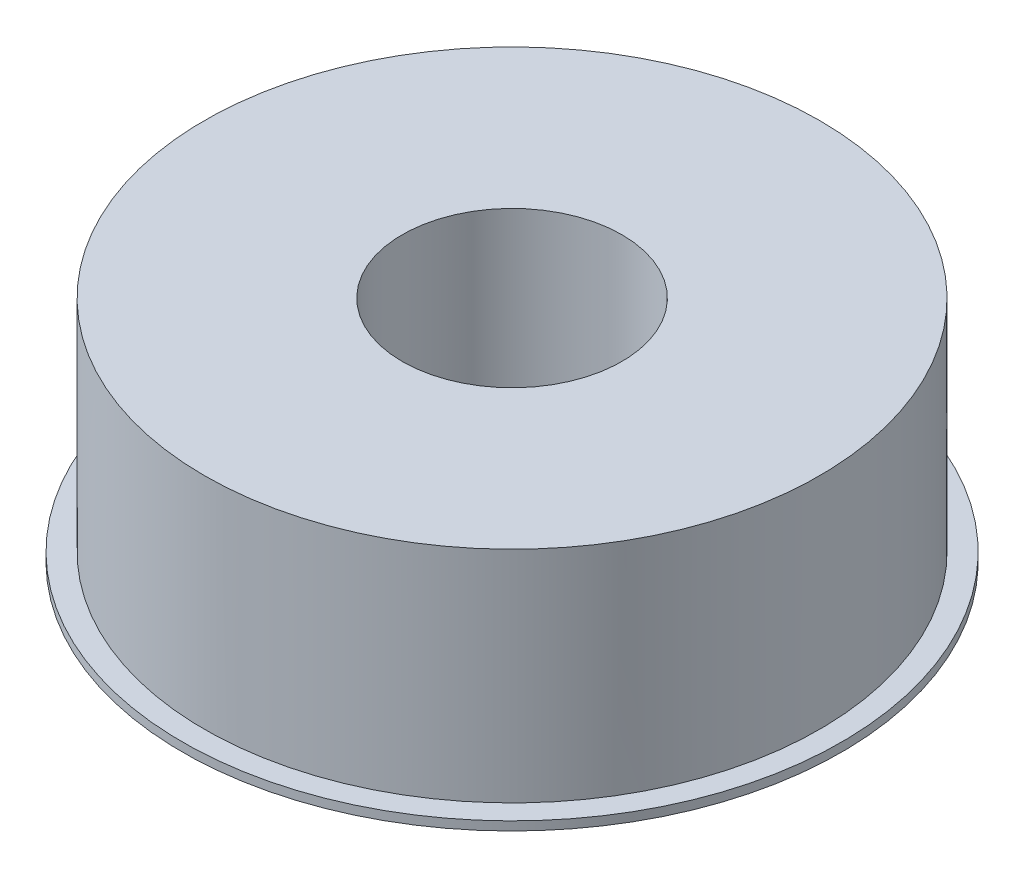
ISO-10303-21;
HEADER;
FILE_DESCRIPTION(('STEP AP214'),'2;1');
FILE_NAME('part.step','',(''),(''),'','','');
FILE_SCHEMA(('AUTOMOTIVE_DESIGN { 1 0 10303 214 1 1 1 1 }'));
ENDSEC;
DATA;
#1=APPLICATION_CONTEXT('core data for automotive mechanical design processes');
#2=APPLICATION_PROTOCOL_DEFINITION('international standard','automotive_design',2000,#1);
#3=PRODUCT_CONTEXT('',#1,'mechanical');
#4=PRODUCT('Part','Part','',(#3));
#5=PRODUCT_RELATED_PRODUCT_CATEGORY('part','',(#4));
#6=PRODUCT_DEFINITION_FORMATION('','',#4);
#7=PRODUCT_DEFINITION_CONTEXT('part definition',#1,'design');
#8=PRODUCT_DEFINITION('design','',#6,#7);
#9=PRODUCT_DEFINITION_SHAPE('','',#8);
#10=(LENGTH_UNIT() NAMED_UNIT(*) SI_UNIT(.MILLI.,.METRE.));
#11=(NAMED_UNIT(*) PLANE_ANGLE_UNIT() SI_UNIT($,.RADIAN.));
#12=(NAMED_UNIT(*) SI_UNIT($,.STERADIAN.) SOLID_ANGLE_UNIT());
#13=UNCERTAINTY_MEASURE_WITH_UNIT(LENGTH_MEASURE(1.E-05),#10,'distance_accuracy_value','');
#14=(GEOMETRIC_REPRESENTATION_CONTEXT(3) GLOBAL_UNCERTAINTY_ASSIGNED_CONTEXT((#13)) GLOBAL_UNIT_ASSIGNED_CONTEXT((#10,
#11,#12)) REPRESENTATION_CONTEXT('',''));
#15=CARTESIAN_POINT('',(0.,0.,0.));
#16=DIRECTION('',(0.,0.,1.));
#17=DIRECTION('',(1.,0.,0.));
#18=AXIS2_PLACEMENT_3D('',#15,#16,#17);
#19=CARTESIAN_POINT('',(0.,5.,0.));
#20=DIRECTION('',(0.,-1.,0.));
#21=DIRECTION('',(0.,0.,-1.));
#22=AXIS2_PLACEMENT_3D('',#19,#20,#21);
#23=CYLINDRICAL_SURFACE('',#22,7.);
#24=CARTESIAN_POINT('',(0.,5.,0.));
#25=DIRECTION('',(0.,1.,0.));
#26=DIRECTION('',(0.,0.,1.));
#27=AXIS2_PLACEMENT_3D('',#24,#25,#26);
#28=CIRCLE('',#27,7.);
#29=CARTESIAN_POINT('',(0.,5.,7.));
#30=VERTEX_POINT('',#29);
#31=EDGE_CURVE('E10',#30,#30,#28,.T.);
#32=ORIENTED_EDGE('',*,*,#31,.F.);
#33=EDGE_LOOP('',(#32));
#34=FACE_BOUND('',#33,.T.);
#35=CARTESIAN_POINT('',(0.,0.,0.));
#36=DIRECTION('',(0.,-1.,0.));
#37=DIRECTION('',(0.,0.,-1.));
#38=AXIS2_PLACEMENT_3D('',#35,#36,#37);
#39=CIRCLE('',#38,7.);
#40=CARTESIAN_POINT('',(0.,0.,-7.));
#41=VERTEX_POINT('',#40);
#42=EDGE_CURVE('E42',#41,#41,#39,.T.);
#43=ORIENTED_EDGE('',*,*,#42,.F.);
#44=EDGE_LOOP('',(#43));
#45=FACE_BOUND('',#44,.T.);
#46=ADVANCED_FACE('F35',(#34,#45),#23,.T.);
#47=CARTESIAN_POINT('',(0.,5.,0.));
#48=DIRECTION('',(0.,1.,0.));
#49=DIRECTION('',(0.,0.,1.));
#50=AXIS2_PLACEMENT_3D('',#47,#48,#49);
#51=PLANE('',#50);
#52=CARTESIAN_POINT('',(0.,5.,0.));
#53=DIRECTION('',(0.,1.,0.));
#54=DIRECTION('',(0.,0.,1.));
#55=AXIS2_PLACEMENT_3D('',#52,#53,#54);
#56=CIRCLE('',#55,2.5);
#57=CARTESIAN_POINT('',(0.,5.,2.5));
#58=VERTEX_POINT('',#57);
#59=EDGE_CURVE('E54',#58,#58,#56,.T.);
#60=ORIENTED_EDGE('',*,*,#59,.F.);
#61=EDGE_LOOP('',(#60));
#62=FACE_BOUND('',#61,.T.);
#63=ORIENTED_EDGE('',*,*,#31,.T.);
#64=EDGE_LOOP('',(#63));
#65=FACE_BOUND('',#64,.T.);
#66=ADVANCED_FACE('F73',(#62,#65),#51,.T.);
#67=CARTESIAN_POINT('',(0.,-0.2,0.));
#68=DIRECTION('',(0.,1.,0.));
#69=DIRECTION('',(0.,0.,1.));
#70=AXIS2_PLACEMENT_3D('',#67,#68,#69);
#71=CYLINDRICAL_SURFACE('',#70,7.5);
#72=CARTESIAN_POINT('',(0.,-0.2,0.));
#73=DIRECTION('',(0.,-1.,0.));
#74=DIRECTION('',(0.,0.,-1.));
#75=AXIS2_PLACEMENT_3D('',#72,#73,#74);
#76=CIRCLE('',#75,7.5);
#77=CARTESIAN_POINT('',(0.,-0.2,-7.5));
#78=VERTEX_POINT('',#77);
#79=EDGE_CURVE('E46',#78,#78,#76,.T.);
#80=ORIENTED_EDGE('',*,*,#79,.F.);
#81=EDGE_LOOP('',(#80));
#82=FACE_BOUND('',#81,.T.);
#83=CARTESIAN_POINT('',(0.,0.,0.));
#84=DIRECTION('',(0.,-1.,0.));
#85=DIRECTION('',(0.,0.,-1.));
#86=AXIS2_PLACEMENT_3D('',#83,#84,#85);
#87=CIRCLE('',#86,7.5);
#88=CARTESIAN_POINT('',(0.,0.,-7.5));
#89=VERTEX_POINT('',#88);
#90=EDGE_CURVE('E49',#89,#89,#87,.T.);
#91=ORIENTED_EDGE('',*,*,#90,.T.);
#92=EDGE_LOOP('',(#91));
#93=FACE_BOUND('',#92,.T.);
#94=ADVANCED_FACE('F67',(#82,#93),#71,.T.);
#95=CARTESIAN_POINT('',(0.,-0.2,0.));
#96=DIRECTION('',(0.,-1.,0.));
#97=DIRECTION('',(0.,0.,-1.));
#98=AXIS2_PLACEMENT_3D('',#95,#96,#97);
#99=PLANE('',#98);
#100=CARTESIAN_POINT('',(0.,-0.2,0.));
#101=DIRECTION('',(0.,-1.,0.));
#102=DIRECTION('',(0.,0.,-1.));
#103=AXIS2_PLACEMENT_3D('',#100,#101,#102);
#104=CIRCLE('',#103,2.5);
#105=CARTESIAN_POINT('',(0.,-0.2,-2.5));
#106=VERTEX_POINT('',#105);
#107=EDGE_CURVE('E38',#106,#106,#104,.T.);
#108=ORIENTED_EDGE('',*,*,#107,.F.);
#109=EDGE_LOOP('',(#108));
#110=FACE_BOUND('',#109,.T.);
#111=ORIENTED_EDGE('',*,*,#79,.T.);
#112=EDGE_LOOP('',(#111));
#113=FACE_BOUND('',#112,.T.);
#114=ADVANCED_FACE('F63',(#110,#113),#99,.T.);
#115=CARTESIAN_POINT('',(0.,0.,0.));
#116=DIRECTION('',(0.,-1.,0.));
#117=DIRECTION('',(0.,0.,-1.));
#118=AXIS2_PLACEMENT_3D('',#115,#116,#117);
#119=PLANE('',#118);
#120=ORIENTED_EDGE('',*,*,#42,.T.);
#121=EDGE_LOOP('',(#120));
#122=FACE_BOUND('',#121,.T.);
#123=ORIENTED_EDGE('',*,*,#90,.F.);
#124=EDGE_LOOP('',(#123));
#125=FACE_BOUND('',#124,.T.);
#126=ADVANCED_FACE('F66',(#122,#125),#119,.F.);
#127=CARTESIAN_POINT('',(0.,-5.,0.));
#128=DIRECTION('',(0.,1.,0.));
#129=DIRECTION('',(0.,0.,1.));
#130=AXIS2_PLACEMENT_3D('',#127,#128,#129);
#131=CYLINDRICAL_SURFACE('',#130,2.5);
#132=ORIENTED_EDGE('',*,*,#107,.T.);
#133=EDGE_LOOP('',(#132));
#134=FACE_BOUND('',#133,.T.);
#135=ORIENTED_EDGE('',*,*,#59,.T.);
#136=EDGE_LOOP('',(#135));
#137=FACE_BOUND('',#136,.T.);
#138=ADVANCED_FACE('F61',(#134,#137),#131,.F.);
#139=CLOSED_SHELL('',(#46,#66,#94,#114,#126,#138));
#140=MANIFOLD_SOLID_BREP('B2',#139);
#141=ADVANCED_BREP_SHAPE_REPRESENTATION('',(#18,#140),#14);
#142=SHAPE_DEFINITION_REPRESENTATION(#9,#141);
ENDSEC;
END-ISO-10303-21;
